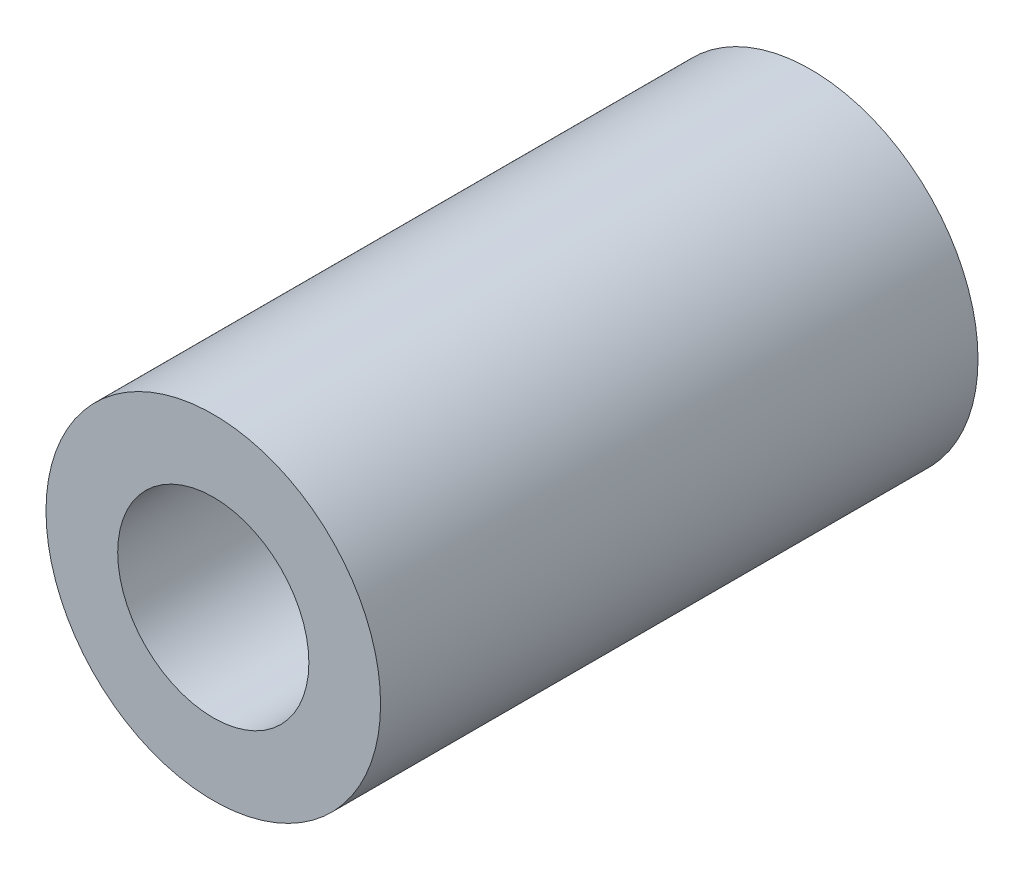
ISO-10303-21;
HEADER;
FILE_DESCRIPTION(('STEP AP214'),'2;1');
FILE_NAME('part.step','',(''),(''),'','','');
FILE_SCHEMA(('AUTOMOTIVE_DESIGN { 1 0 10303 214 1 1 1 1 }'));
ENDSEC;
DATA;
#1=APPLICATION_CONTEXT('core data for automotive mechanical design processes');
#2=APPLICATION_PROTOCOL_DEFINITION('international standard','automotive_design',2000,#1);
#3=PRODUCT_CONTEXT('',#1,'mechanical');
#4=PRODUCT('Part','Part','',(#3));
#5=PRODUCT_RELATED_PRODUCT_CATEGORY('part','',(#4));
#6=PRODUCT_DEFINITION_FORMATION('','',#4);
#7=PRODUCT_DEFINITION_CONTEXT('part definition',#1,'design');
#8=PRODUCT_DEFINITION('design','',#6,#7);
#9=PRODUCT_DEFINITION_SHAPE('','',#8);
#10=(LENGTH_UNIT() NAMED_UNIT(*) SI_UNIT(.MILLI.,.METRE.));
#11=(NAMED_UNIT(*) PLANE_ANGLE_UNIT() SI_UNIT($,.RADIAN.));
#12=(NAMED_UNIT(*) SI_UNIT($,.STERADIAN.) SOLID_ANGLE_UNIT());
#13=UNCERTAINTY_MEASURE_WITH_UNIT(LENGTH_MEASURE(1.E-05),#10,'distance_accuracy_value','');
#14=(GEOMETRIC_REPRESENTATION_CONTEXT(3) GLOBAL_UNCERTAINTY_ASSIGNED_CONTEXT((#13)) GLOBAL_UNIT_ASSIGNED_CONTEXT((#10,
#11,#12)) REPRESENTATION_CONTEXT('',''));
#15=CARTESIAN_POINT('',(0.,0.,0.));
#16=DIRECTION('',(0.,0.,1.));
#17=DIRECTION('',(1.,0.,0.));
#18=AXIS2_PLACEMENT_3D('',#15,#16,#17);
#19=CARTESIAN_POINT('',(0.,0.,25.));
#20=DIRECTION('',(0.,0.,-1.));
#21=DIRECTION('',(-1.,0.,0.));
#22=AXIS2_PLACEMENT_3D('',#19,#20,#21);
#23=CYLINDRICAL_SURFACE('',#22,3.);
#24=CARTESIAN_POINT('',(0.,0.,0.));
#25=DIRECTION('',(0.,0.,1.));
#26=DIRECTION('',(1.,0.,0.));
#27=AXIS2_PLACEMENT_3D('',#24,#25,#26);
#28=CIRCLE('',#27,3.);
#29=CARTESIAN_POINT('',(3.,0.,0.));
#30=VERTEX_POINT('',#29);
#31=EDGE_CURVE('E55',#30,#30,#28,.T.);
#32=ORIENTED_EDGE('',*,*,#31,.F.);
#33=EDGE_LOOP('',(#32));
#34=FACE_BOUND('',#33,.T.);
#35=CARTESIAN_POINT('',(0.,0.,12.));
#36=DIRECTION('',(0.,0.,1.));
#37=DIRECTION('',(1.,0.,0.));
#38=AXIS2_PLACEMENT_3D('',#35,#36,#37);
#39=CIRCLE('',#38,3.);
#40=CARTESIAN_POINT('',(3.,0.,12.));
#41=VERTEX_POINT('',#40);
#42=EDGE_CURVE('E43',#41,#41,#39,.T.);
#43=ORIENTED_EDGE('',*,*,#42,.T.);
#44=EDGE_LOOP('',(#43));
#45=FACE_BOUND('',#44,.T.);
#46=ADVANCED_FACE('F39',(#34,#45),#23,.F.);
#47=CARTESIAN_POINT('',(0.,0.,25.));
#48=DIRECTION('',(0.,0.,1.));
#49=DIRECTION('',(1.,0.,0.));
#50=AXIS2_PLACEMENT_3D('',#47,#48,#49);
#51=PLANE('',#50);
#52=CARTESIAN_POINT('',(0.,0.,25.));
#53=DIRECTION('',(0.,0.,1.));
#54=DIRECTION('',(1.,0.,0.));
#55=AXIS2_PLACEMENT_3D('',#52,#53,#54);
#56=CIRCLE('',#55,4.);
#57=CARTESIAN_POINT('',(4.,0.,25.));
#58=VERTEX_POINT('',#57);
#59=EDGE_CURVE('E57',#58,#58,#56,.T.);
#60=ORIENTED_EDGE('',*,*,#59,.F.);
#61=EDGE_LOOP('',(#60));
#62=FACE_BOUND('',#61,.T.);
#63=CARTESIAN_POINT('',(0.,0.,25.));
#64=DIRECTION('',(0.,0.,1.));
#65=DIRECTION('',(1.,0.,0.));
#66=AXIS2_PLACEMENT_3D('',#63,#64,#65);
#67=CIRCLE('',#66,7.);
#68=CARTESIAN_POINT('',(7.,0.,25.));
#69=VERTEX_POINT('',#68);
#70=EDGE_CURVE('E10',#69,#69,#67,.T.);
#71=ORIENTED_EDGE('',*,*,#70,.T.);
#72=EDGE_LOOP('',(#71));
#73=FACE_BOUND('',#72,.T.);
#74=ADVANCED_FACE('F80',(#62,#73),#51,.T.);
#75=CARTESIAN_POINT('',(0.,0.,0.));
#76=DIRECTION('',(0.,0.,1.));
#77=DIRECTION('',(1.,0.,0.));
#78=AXIS2_PLACEMENT_3D('',#75,#76,#77);
#79=PLANE('',#78);
#80=CARTESIAN_POINT('',(0.,0.,0.));
#81=DIRECTION('',(0.,0.,1.));
#82=DIRECTION('',(1.,0.,0.));
#83=AXIS2_PLACEMENT_3D('',#80,#81,#82);
#84=CIRCLE('',#83,7.);
#85=CARTESIAN_POINT('',(7.,0.,0.));
#86=VERTEX_POINT('',#85);
#87=EDGE_CURVE('E50',#86,#86,#84,.T.);
#88=ORIENTED_EDGE('',*,*,#87,.F.);
#89=EDGE_LOOP('',(#88));
#90=FACE_BOUND('',#89,.T.);
#91=ORIENTED_EDGE('',*,*,#31,.T.);
#92=EDGE_LOOP('',(#91));
#93=FACE_BOUND('',#92,.T.);
#94=ADVANCED_FACE('F83',(#90,#93),#79,.F.);
#95=CARTESIAN_POINT('',(0.,0.,25.));
#96=DIRECTION('',(0.,0.,-1.));
#97=DIRECTION('',(-1.,0.,0.));
#98=AXIS2_PLACEMENT_3D('',#95,#96,#97);
#99=CYLINDRICAL_SURFACE('',#98,7.);
#100=ORIENTED_EDGE('',*,*,#70,.F.);
#101=EDGE_LOOP('',(#100));
#102=FACE_BOUND('',#101,.T.);
#103=ORIENTED_EDGE('',*,*,#87,.T.);
#104=EDGE_LOOP('',(#103));
#105=FACE_BOUND('',#104,.T.);
#106=ADVANCED_FACE('F41',(#102,#105),#99,.T.);
#107=CARTESIAN_POINT('',(0.,0.,12.));
#108=DIRECTION('',(0.,0.,1.));
#109=DIRECTION('',(1.,0.,0.));
#110=AXIS2_PLACEMENT_3D('',#107,#108,#109);
#111=CYLINDRICAL_SURFACE('',#110,4.);
#112=CARTESIAN_POINT('',(0.,0.,12.));
#113=DIRECTION('',(0.,0.,1.));
#114=DIRECTION('',(1.,0.,0.));
#115=AXIS2_PLACEMENT_3D('',#112,#113,#114);
#116=CIRCLE('',#115,4.);
#117=CARTESIAN_POINT('',(4.,0.,12.));
#118=VERTEX_POINT('',#117);
#119=EDGE_CURVE('E56',#118,#118,#116,.T.);
#120=CARTESIAN_POINT('',(4.,0.,12.));
#121=CARTESIAN_POINT('',(4.,0.,12.1354166666667));
#122=CARTESIAN_POINT('',(4.,0.,12.2708333333333));
#123=CARTESIAN_POINT('',(4.,0.,12.5416666666667));
#124=CARTESIAN_POINT('',(4.,0.,12.6770833333333));
#125=CARTESIAN_POINT('',(4.,0.,12.9479166666667));
#126=CARTESIAN_POINT('',(4.,0.,13.0833333333333));
#127=CARTESIAN_POINT('',(4.,0.,13.3541666666667));
#128=CARTESIAN_POINT('',(4.,0.,13.4895833333333));
#129=CARTESIAN_POINT('',(4.,0.,13.7604166666667));
#130=CARTESIAN_POINT('',(4.,0.,13.8958333333333));
#131=CARTESIAN_POINT('',(4.,0.,14.1666666666667));
#132=CARTESIAN_POINT('',(4.,0.,14.3020833333333));
#133=CARTESIAN_POINT('',(4.,0.,14.5729166666667));
#134=CARTESIAN_POINT('',(4.,0.,14.7083333333333));
#135=CARTESIAN_POINT('',(4.,0.,14.9791666666667));
#136=CARTESIAN_POINT('',(4.,0.,15.1145833333333));
#137=CARTESIAN_POINT('',(4.,0.,15.3854166666667));
#138=CARTESIAN_POINT('',(4.,0.,15.5208333333333));
#139=CARTESIAN_POINT('',(4.,0.,15.7916666666667));
#140=CARTESIAN_POINT('',(4.,0.,15.9270833333333));
#141=CARTESIAN_POINT('',(4.,0.,16.1979166666667));
#142=CARTESIAN_POINT('',(4.,0.,16.3333333333333));
#143=CARTESIAN_POINT('',(4.,0.,16.6041666666667));
#144=CARTESIAN_POINT('',(4.,0.,16.7395833333333));
#145=CARTESIAN_POINT('',(4.,0.,17.0104166666667));
#146=CARTESIAN_POINT('',(4.,0.,17.1458333333333));
#147=CARTESIAN_POINT('',(4.,0.,17.4166666666667));
#148=CARTESIAN_POINT('',(4.,0.,17.5520833333333));
#149=CARTESIAN_POINT('',(4.,0.,17.8229166666667));
#150=CARTESIAN_POINT('',(4.,0.,17.9583333333333));
#151=CARTESIAN_POINT('',(4.,0.,18.2291666666667));
#152=CARTESIAN_POINT('',(4.,0.,18.3645833333333));
#153=CARTESIAN_POINT('',(4.,0.,18.6354166666667));
#154=CARTESIAN_POINT('',(4.,0.,18.7708333333333));
#155=CARTESIAN_POINT('',(4.,0.,19.0416666666667));
#156=CARTESIAN_POINT('',(4.,0.,19.1770833333333));
#157=CARTESIAN_POINT('',(4.,0.,19.4479166666667));
#158=CARTESIAN_POINT('',(4.,0.,19.5833333333333));
#159=CARTESIAN_POINT('',(4.,0.,19.8541666666667));
#160=CARTESIAN_POINT('',(4.,0.,19.9895833333333));
#161=CARTESIAN_POINT('',(4.,0.,20.2604166666667));
#162=CARTESIAN_POINT('',(4.,0.,20.3958333333333));
#163=CARTESIAN_POINT('',(4.,0.,20.6666666666667));
#164=CARTESIAN_POINT('',(4.,0.,20.8020833333333));
#165=CARTESIAN_POINT('',(4.,0.,21.0729166666667));
#166=CARTESIAN_POINT('',(4.,0.,21.2083333333333));
#167=CARTESIAN_POINT('',(4.,0.,21.4791666666667));
#168=CARTESIAN_POINT('',(4.,0.,21.6145833333333));
#169=CARTESIAN_POINT('',(4.,0.,21.8854166666667));
#170=CARTESIAN_POINT('',(4.,0.,22.0208333333333));
#171=CARTESIAN_POINT('',(4.,0.,22.2916666666667));
#172=CARTESIAN_POINT('',(4.,0.,22.4270833333333));
#173=CARTESIAN_POINT('',(4.,0.,22.6979166666667));
#174=CARTESIAN_POINT('',(4.,0.,22.8333333333333));
#175=CARTESIAN_POINT('',(4.,0.,23.1041666666667));
#176=CARTESIAN_POINT('',(4.,0.,23.2395833333333));
#177=CARTESIAN_POINT('',(4.,0.,23.5104166666667));
#178=CARTESIAN_POINT('',(4.,0.,23.6458333333333));
#179=CARTESIAN_POINT('',(4.,0.,23.9166666666667));
#180=CARTESIAN_POINT('',(4.,0.,24.0520833333333));
#181=CARTESIAN_POINT('',(4.,0.,24.3229166666667));
#182=CARTESIAN_POINT('',(4.,0.,24.4583333333333));
#183=CARTESIAN_POINT('',(4.,0.,24.7291666666667));
#184=CARTESIAN_POINT('',(4.,0.,24.8645833333333));
#185=CARTESIAN_POINT('',(4.,0.,25.));
#186=B_SPLINE_CURVE_WITH_KNOTS('',3,(#120,#121,#122,#123,#124,#125,#126,#127,#128,#129,#130,
#131,#132,#133,#134,#135,#136,#137,#138,#139,#140,#141,#142,#143,#144,#145,#146,#147,#148,#149,
#150,#151,#152,#153,#154,#155,#156,#157,#158,#159,#160,#161,#162,#163,#164,#165,#166,#167,#168,
#169,#170,#171,#172,#173,#174,#175,#176,#177,#178,#179,#180,#181,#182,#183,#184,#185),
.UNSPECIFIED.,.F.,.F.,(4,2,2,2,2,2,2,2,2,2,2,2,2,2,2,2,2,2,2,2,2,2,2,2,2,2,2,2,2,2,2,2,4),(0.,
0.406249999999999,0.812499999999999,1.21875,1.625,2.03125,2.4375,2.84375,3.25,3.65625,4.0625,
4.46875,4.875,5.28125,5.6875,6.09375,6.5,6.90625,7.3125,7.71875,8.12499999999999,8.53125,8.9375,
9.34375,9.75,10.15625,10.5625,10.96875,11.375,11.78125,12.1875,12.59375,13.),.UNSPECIFIED.);
#187=EDGE_CURVE('BSEAM68',#118,#58,#186,.T.);
#188=ORIENTED_EDGE('',*,*,#119,.F.);
#189=ORIENTED_EDGE('',*,*,#59,.T.);
#190=ORIENTED_EDGE('',*,*,#187,.T.);
#191=ORIENTED_EDGE('',*,*,#187,.F.);
#192=EDGE_LOOP('',(#188,#190,#189,#191));
#193=FACE_BOUND('',#192,.T.);
#194=ADVANCED_FACE('F68',(#193),#111,.F.);
#195=CARTESIAN_POINT('',(0.,0.,12.));
#196=DIRECTION('',(0.,0.,1.));
#197=DIRECTION('',(1.,0.,0.));
#198=AXIS2_PLACEMENT_3D('',#195,#196,#197);
#199=PLANE('',#198);
#200=ORIENTED_EDGE('',*,*,#42,.F.);
#201=EDGE_LOOP('',(#200));
#202=FACE_BOUND('',#201,.T.);
#203=ORIENTED_EDGE('',*,*,#119,.T.);
#204=EDGE_LOOP('',(#203));
#205=FACE_BOUND('',#204,.T.);
#206=ADVANCED_FACE('F70',(#202,#205),#199,.T.);
#207=CLOSED_SHELL('',(#46,#74,#94,#106,#194,#206));
#208=MANIFOLD_SOLID_BREP('B2',#207);
#209=ADVANCED_BREP_SHAPE_REPRESENTATION('',(#18,#208),#14);
#210=SHAPE_DEFINITION_REPRESENTATION(#9,#209);
ENDSEC;
END-ISO-10303-21;
